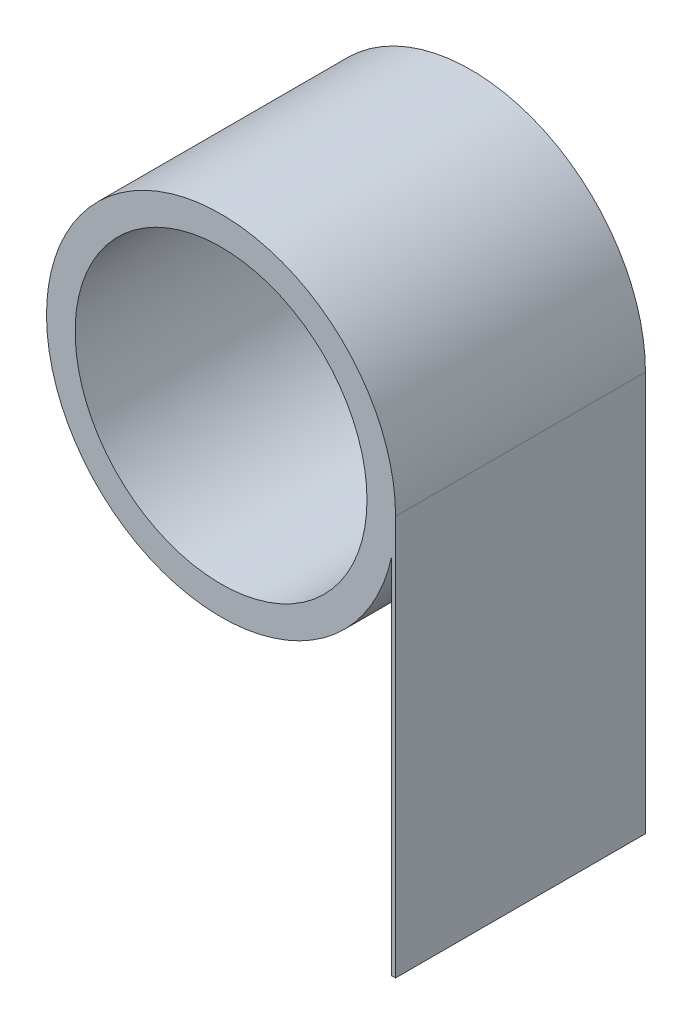
ISO-10303-21;
HEADER;
FILE_DESCRIPTION(('STEP AP214'),'2;1');
FILE_NAME('part.step','',(''),(''),'','','');
FILE_SCHEMA(('AUTOMOTIVE_DESIGN { 1 0 10303 214 1 1 1 1 }'));
ENDSEC;
DATA;
#1=APPLICATION_CONTEXT('core data for automotive mechanical design processes');
#2=APPLICATION_PROTOCOL_DEFINITION('international standard','automotive_design',2000,#1);
#3=PRODUCT_CONTEXT('',#1,'mechanical');
#4=PRODUCT('Part','Part','',(#3));
#5=PRODUCT_RELATED_PRODUCT_CATEGORY('part','',(#4));
#6=PRODUCT_DEFINITION_FORMATION('','',#4);
#7=PRODUCT_DEFINITION_CONTEXT('part definition',#1,'design');
#8=PRODUCT_DEFINITION('design','',#6,#7);
#9=PRODUCT_DEFINITION_SHAPE('','',#8);
#10=(LENGTH_UNIT() NAMED_UNIT(*) SI_UNIT(.MILLI.,.METRE.));
#11=(NAMED_UNIT(*) PLANE_ANGLE_UNIT() SI_UNIT($,.RADIAN.));
#12=(NAMED_UNIT(*) SI_UNIT($,.STERADIAN.) SOLID_ANGLE_UNIT());
#13=UNCERTAINTY_MEASURE_WITH_UNIT(LENGTH_MEASURE(1.E-05),#10,'distance_accuracy_value','');
#14=(GEOMETRIC_REPRESENTATION_CONTEXT(3) GLOBAL_UNCERTAINTY_ASSIGNED_CONTEXT((#13)) GLOBAL_UNIT_ASSIGNED_CONTEXT((#10,
#11,#12)) REPRESENTATION_CONTEXT('',''));
#15=CARTESIAN_POINT('',(0.,0.,0.));
#16=DIRECTION('',(0.,0.,1.));
#17=DIRECTION('',(1.,0.,0.));
#18=AXIS2_PLACEMENT_3D('',#15,#16,#17);
#19=CARTESIAN_POINT('',(0.,0.,15.875));
#20=DIRECTION('',(0.,0.,1.));
#21=DIRECTION('',(1.,0.,0.));
#22=AXIS2_PLACEMENT_3D('',#19,#20,#21);
#23=PLANE('',#22);
#24=CARTESIAN_POINT('',(0.,0.,15.875));
#25=DIRECTION('',(0.,0.,1.));
#26=DIRECTION('',(1.,0.,0.));
#27=AXIS2_PLACEMENT_3D('',#24,#25,#26);
#28=CIRCLE('',#27,11.0871);
#29=CARTESIAN_POINT('',(11.0871,0.,15.875));
#30=VERTEX_POINT('',#29);
#31=CARTESIAN_POINT('',(10.8331,-2.35960394981869,15.875));
#32=VERTEX_POINT('',#31);
#33=EDGE_CURVE('E11',#30,#32,#28,.T.);
#34=ORIENTED_EDGE('',*,*,#33,.T.);
#35=DIRECTION('',(0.,-1.,0.));
#36=VECTOR('',#35,1.);
#37=CARTESIAN_POINT('',(10.8331,-25.4,15.875));
#38=LINE('',#37,#36);
#39=CARTESIAN_POINT('',(10.8331,-25.4,15.875));
#40=VERTEX_POINT('',#39);
#41=EDGE_CURVE('E89',#32,#40,#38,.T.);
#42=ORIENTED_EDGE('',*,*,#41,.T.);
#43=DIRECTION('',(1.,0.,0.));
#44=VECTOR('',#43,1.);
#45=CARTESIAN_POINT('',(11.0871,-25.4,15.875));
#46=LINE('',#45,#44);
#47=CARTESIAN_POINT('',(11.0871,-25.4,15.875));
#48=VERTEX_POINT('',#47);
#49=EDGE_CURVE('E97',#40,#48,#46,.T.);
#50=ORIENTED_EDGE('',*,*,#49,.T.);
#51=DIRECTION('',(0.,1.,0.));
#52=VECTOR('',#51,1.);
#53=CARTESIAN_POINT('',(11.0871,0.,15.875));
#54=LINE('',#53,#52);
#55=EDGE_CURVE('E104',#48,#30,#54,.T.);
#56=ORIENTED_EDGE('',*,*,#55,.T.);
#57=EDGE_LOOP('',(#34,#42,#50,#56));
#58=FACE_BOUND('',#57,.T.);
#59=CARTESIAN_POINT('',(0.,0.,15.875));
#60=DIRECTION('',(0.,0.,1.));
#61=DIRECTION('',(1.,0.,0.));
#62=AXIS2_PLACEMENT_3D('',#59,#60,#61);
#63=CIRCLE('',#62,9.271);
#64=CARTESIAN_POINT('',(9.271,0.,15.875));
#65=VERTEX_POINT('',#64);
#66=EDGE_CURVE('E127',#65,#65,#63,.T.);
#67=ORIENTED_EDGE('',*,*,#66,.F.);
#68=EDGE_LOOP('',(#67));
#69=FACE_BOUND('',#68,.T.);
#70=ADVANCED_FACE('F45',(#58,#69),#23,.T.);
#71=CARTESIAN_POINT('',(0.,0.,0.));
#72=DIRECTION('',(0.,0.,1.));
#73=DIRECTION('',(1.,0.,0.));
#74=AXIS2_PLACEMENT_3D('',#71,#72,#73);
#75=PLANE('',#74);
#76=CARTESIAN_POINT('',(0.,0.,0.));
#77=DIRECTION('',(0.,0.,1.));
#78=DIRECTION('',(1.,0.,0.));
#79=AXIS2_PLACEMENT_3D('',#76,#77,#78);
#80=CIRCLE('',#79,11.0871);
#81=CARTESIAN_POINT('',(11.0871,0.,0.));
#82=VERTEX_POINT('',#81);
#83=CARTESIAN_POINT('',(10.8331,-2.35960394981869,0.));
#84=VERTEX_POINT('',#83);
#85=EDGE_CURVE('E49',#82,#84,#80,.T.);
#86=ORIENTED_EDGE('',*,*,#85,.F.);
#87=DIRECTION('',(0.,-1.,0.));
#88=VECTOR('',#87,1.);
#89=CARTESIAN_POINT('',(11.0871,0.,0.));
#90=LINE('',#89,#88);
#91=CARTESIAN_POINT('',(11.0871,-25.4,0.));
#92=VERTEX_POINT('',#91);
#93=EDGE_CURVE('E110',#82,#92,#90,.T.);
#94=ORIENTED_EDGE('',*,*,#93,.T.);
#95=DIRECTION('',(-1.,0.,0.));
#96=VECTOR('',#95,1.);
#97=CARTESIAN_POINT('',(11.0871,-25.4,0.));
#98=LINE('',#97,#96);
#99=CARTESIAN_POINT('',(10.8331,-25.4,0.));
#100=VERTEX_POINT('',#99);
#101=EDGE_CURVE('E119',#92,#100,#98,.T.);
#102=ORIENTED_EDGE('',*,*,#101,.T.);
#103=DIRECTION('',(0.,1.,0.));
#104=VECTOR('',#103,1.);
#105=CARTESIAN_POINT('',(10.8331,-25.4,0.));
#106=LINE('',#105,#104);
#107=EDGE_CURVE('E90',#100,#84,#106,.T.);
#108=ORIENTED_EDGE('',*,*,#107,.T.);
#109=EDGE_LOOP('',(#86,#94,#102,#108));
#110=FACE_BOUND('',#109,.T.);
#111=CARTESIAN_POINT('',(0.,0.,0.));
#112=DIRECTION('',(0.,0.,1.));
#113=DIRECTION('',(1.,0.,0.));
#114=AXIS2_PLACEMENT_3D('',#111,#112,#113);
#115=CIRCLE('',#114,9.271);
#116=CARTESIAN_POINT('',(9.271,0.,0.));
#117=VERTEX_POINT('',#116);
#118=EDGE_CURVE('E126',#117,#117,#115,.T.);
#119=ORIENTED_EDGE('',*,*,#118,.T.);
#120=EDGE_LOOP('',(#119));
#121=FACE_BOUND('',#120,.T.);
#122=ADVANCED_FACE('F135',(#110,#121),#75,.F.);
#123=CARTESIAN_POINT('',(0.,0.,15.875));
#124=DIRECTION('',(0.,0.,-1.));
#125=DIRECTION('',(-1.,0.,0.));
#126=AXIS2_PLACEMENT_3D('',#123,#124,#125);
#127=CYLINDRICAL_SURFACE('',#126,11.0871);
#128=ORIENTED_EDGE('',*,*,#33,.F.);
#129=DIRECTION('',(0.,0.,1.));
#130=VECTOR('',#129,1.);
#131=CARTESIAN_POINT('',(11.0871,0.,-25.4012699682516));
#132=LINE('',#131,#130);
#133=EDGE_CURVE('E115',#82,#30,#132,.T.);
#134=ORIENTED_EDGE('',*,*,#133,.F.);
#135=ORIENTED_EDGE('',*,*,#85,.T.);
#136=DIRECTION('',(0.,0.,1.));
#137=VECTOR('',#136,1.);
#138=CARTESIAN_POINT('',(10.8331,-2.35960394981869,-25.4012699682516));
#139=LINE('',#138,#137);
#140=EDGE_CURVE('E65',#84,#32,#139,.T.);
#141=ORIENTED_EDGE('',*,*,#140,.T.);
#142=EDGE_LOOP('',(#128,#134,#135,#141));
#143=FACE_BOUND('',#142,.T.);
#144=ADVANCED_FACE('F47',(#143),#127,.T.);
#145=CARTESIAN_POINT('',(0.,0.,15.875));
#146=DIRECTION('',(0.,0.,-1.));
#147=DIRECTION('',(-1.,0.,0.));
#148=AXIS2_PLACEMENT_3D('',#145,#146,#147);
#149=CYLINDRICAL_SURFACE('',#148,9.271);
#150=ORIENTED_EDGE('',*,*,#66,.T.);
#151=EDGE_LOOP('',(#150));
#152=FACE_BOUND('',#151,.T.);
#153=ORIENTED_EDGE('',*,*,#118,.F.);
#154=EDGE_LOOP('',(#153));
#155=FACE_BOUND('',#154,.T.);
#156=ADVANCED_FACE('F137',(#152,#155),#149,.F.);
#157=CARTESIAN_POINT('',(11.0871,0.,-25.4012699682516));
#158=DIRECTION('',(1.,0.,0.));
#159=DIRECTION('',(0.,1.,0.));
#160=AXIS2_PLACEMENT_3D('',#157,#158,#159);
#161=PLANE('',#160);
#162=ORIENTED_EDGE('',*,*,#93,.F.);
#163=ORIENTED_EDGE('',*,*,#133,.T.);
#164=ORIENTED_EDGE('',*,*,#55,.F.);
#165=DIRECTION('',(0.,0.,1.));
#166=VECTOR('',#165,1.);
#167=CARTESIAN_POINT('',(11.0871,-25.4,-25.4012699682516));
#168=LINE('',#167,#166);
#169=EDGE_CURVE('E94',#92,#48,#168,.T.);
#170=ORIENTED_EDGE('',*,*,#169,.F.);
#171=EDGE_LOOP('',(#162,#163,#164,#170));
#172=FACE_BOUND('',#171,.T.);
#173=ADVANCED_FACE('F139',(#172),#161,.T.);
#174=CARTESIAN_POINT('',(11.0871,-25.4,-25.4012699682516));
#175=DIRECTION('',(0.,-1.,0.));
#176=DIRECTION('',(1.,0.,0.));
#177=AXIS2_PLACEMENT_3D('',#174,#175,#176);
#178=PLANE('',#177);
#179=ORIENTED_EDGE('',*,*,#101,.F.);
#180=ORIENTED_EDGE('',*,*,#169,.T.);
#181=ORIENTED_EDGE('',*,*,#49,.F.);
#182=DIRECTION('',(0.,0.,1.));
#183=VECTOR('',#182,1.);
#184=CARTESIAN_POINT('',(10.8331,-25.4,-25.4012699682516));
#185=LINE('',#184,#183);
#186=EDGE_CURVE('E85',#100,#40,#185,.T.);
#187=ORIENTED_EDGE('',*,*,#186,.F.);
#188=EDGE_LOOP('',(#179,#180,#181,#187));
#189=FACE_BOUND('',#188,.T.);
#190=ADVANCED_FACE('F98',(#189),#178,.T.);
#191=CARTESIAN_POINT('',(10.8331,-25.4,-25.4012699682516));
#192=DIRECTION('',(-1.,0.,0.));
#193=DIRECTION('',(0.,-1.,0.));
#194=AXIS2_PLACEMENT_3D('',#191,#192,#193);
#195=PLANE('',#194);
#196=ORIENTED_EDGE('',*,*,#107,.F.);
#197=ORIENTED_EDGE('',*,*,#186,.T.);
#198=ORIENTED_EDGE('',*,*,#41,.F.);
#199=ORIENTED_EDGE('',*,*,#140,.F.);
#200=EDGE_LOOP('',(#196,#197,#198,#199));
#201=FACE_BOUND('',#200,.T.);
#202=ADVANCED_FACE('F87',(#201),#195,.T.);
#203=CLOSED_SHELL('',(#70,#122,#144,#156,#173,#190,#202));
#204=MANIFOLD_SOLID_BREP('B2',#203);
#205=ADVANCED_BREP_SHAPE_REPRESENTATION('',(#18,#204),#14);
#206=SHAPE_DEFINITION_REPRESENTATION(#9,#205);
ENDSEC;
END-ISO-10303-21;
